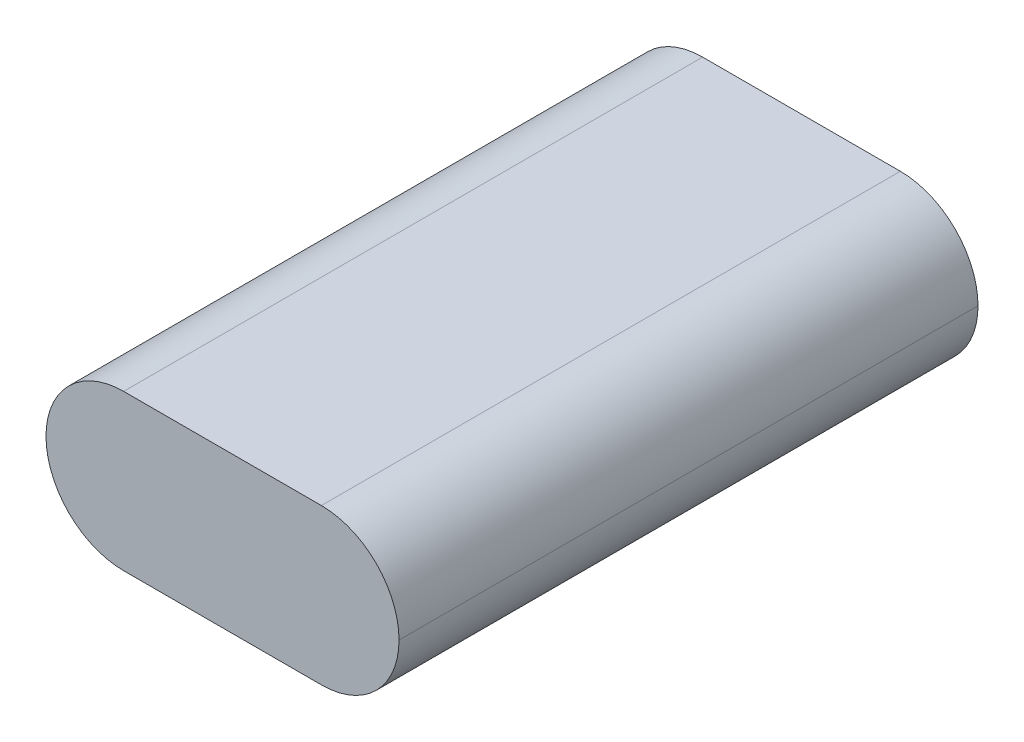
ISO-10303-21;
HEADER;
FILE_DESCRIPTION(('STEP AP214'),'2;1');
FILE_NAME('part.step','',(''),(''),'','','');
FILE_SCHEMA(('AUTOMOTIVE_DESIGN { 1 0 10303 214 1 1 1 1 }'));
ENDSEC;
DATA;
#1=APPLICATION_CONTEXT('core data for automotive mechanical design processes');
#2=APPLICATION_PROTOCOL_DEFINITION('international standard','automotive_design',2000,#1);
#3=PRODUCT_CONTEXT('',#1,'mechanical');
#4=PRODUCT('Part','Part','',(#3));
#5=PRODUCT_RELATED_PRODUCT_CATEGORY('part','',(#4));
#6=PRODUCT_DEFINITION_FORMATION('','',#4);
#7=PRODUCT_DEFINITION_CONTEXT('part definition',#1,'design');
#8=PRODUCT_DEFINITION('design','',#6,#7);
#9=PRODUCT_DEFINITION_SHAPE('','',#8);
#10=(LENGTH_UNIT() NAMED_UNIT(*) SI_UNIT(.MILLI.,.METRE.));
#11=(NAMED_UNIT(*) PLANE_ANGLE_UNIT() SI_UNIT($,.RADIAN.));
#12=(NAMED_UNIT(*) SI_UNIT($,.STERADIAN.) SOLID_ANGLE_UNIT());
#13=UNCERTAINTY_MEASURE_WITH_UNIT(LENGTH_MEASURE(1.E-05),#10,'distance_accuracy_value','');
#14=(GEOMETRIC_REPRESENTATION_CONTEXT(3) GLOBAL_UNCERTAINTY_ASSIGNED_CONTEXT((#13)) GLOBAL_UNIT_ASSIGNED_CONTEXT((#10,
#11,#12)) REPRESENTATION_CONTEXT('',''));
#15=CARTESIAN_POINT('',(0.,0.,0.));
#16=DIRECTION('',(0.,0.,1.));
#17=DIRECTION('',(1.,0.,0.));
#18=AXIS2_PLACEMENT_3D('',#15,#16,#17);
#19=CARTESIAN_POINT('',(0.,11.,-41.));
#20=DIRECTION('',(0.,0.,1.));
#21=DIRECTION('',(1.,0.,0.));
#22=AXIS2_PLACEMENT_3D('',#19,#20,#21);
#23=PLANE('',#22);
#24=CARTESIAN_POINT('',(-19.5,5.5,-41.));
#25=DIRECTION('',(0.,0.,1.));
#26=DIRECTION('',(1.,0.,0.));
#27=AXIS2_PLACEMENT_3D('',#24,#25,#26);
#28=CIRCLE('',#27,5.5);
#29=CARTESIAN_POINT('',(-19.5,0.,-41.));
#30=VERTEX_POINT('',#29);
#31=CARTESIAN_POINT('',(-25.,5.5,-41.));
#32=VERTEX_POINT('',#31);
#33=EDGE_CURVE('E61',#30,#32,#28,.F.);
#34=ORIENTED_EDGE('',*,*,#33,.T.);
#35=CARTESIAN_POINT('',(-19.5,5.5,-41.));
#36=DIRECTION('',(0.,0.,1.));
#37=DIRECTION('',(1.,0.,0.));
#38=AXIS2_PLACEMENT_3D('',#35,#36,#37);
#39=CIRCLE('',#38,5.5);
#40=CARTESIAN_POINT('',(-19.5,11.,-41.));
#41=VERTEX_POINT('',#40);
#42=EDGE_CURVE('E105',#32,#41,#39,.F.);
#43=ORIENTED_EDGE('',*,*,#42,.T.);
#44=DIRECTION('',(-1.,0.,0.));
#45=VECTOR('',#44,1.);
#46=CARTESIAN_POINT('',(0.,11.,-41.));
#47=LINE('',#46,#45);
#48=CARTESIAN_POINT('',(-5.5,11.,-41.));
#49=VERTEX_POINT('',#48);
#50=EDGE_CURVE('E96',#49,#41,#47,.T.);
#51=ORIENTED_EDGE('',*,*,#50,.F.);
#52=CARTESIAN_POINT('',(-5.5,5.5,-41.));
#53=DIRECTION('',(0.,0.,1.));
#54=DIRECTION('',(1.,0.,0.));
#55=AXIS2_PLACEMENT_3D('',#52,#53,#54);
#56=CIRCLE('',#55,5.5);
#57=CARTESIAN_POINT('',(0.,5.5,-41.));
#58=VERTEX_POINT('',#57);
#59=EDGE_CURVE('E54',#49,#58,#56,.F.);
#60=ORIENTED_EDGE('',*,*,#59,.T.);
#61=CARTESIAN_POINT('',(-5.5,5.5,-41.));
#62=DIRECTION('',(0.,0.,1.));
#63=DIRECTION('',(1.,0.,0.));
#64=AXIS2_PLACEMENT_3D('',#61,#62,#63);
#65=CIRCLE('',#64,5.5);
#66=CARTESIAN_POINT('',(-5.5,0.,-41.));
#67=VERTEX_POINT('',#66);
#68=EDGE_CURVE('E110',#58,#67,#65,.F.);
#69=ORIENTED_EDGE('',*,*,#68,.T.);
#70=DIRECTION('',(-1.,0.,0.));
#71=VECTOR('',#70,1.);
#72=CARTESIAN_POINT('',(0.,0.,-41.));
#73=LINE('',#72,#71);
#74=EDGE_CURVE('E123',#67,#30,#73,.T.);
#75=ORIENTED_EDGE('',*,*,#74,.T.);
#76=EDGE_LOOP('',(#34,#43,#51,#60,#69,#75));
#77=FACE_BOUND('',#76,.T.);
#78=ADVANCED_FACE('F37',(#77),#23,.F.);
#79=CARTESIAN_POINT('',(0.,11.,0.));
#80=DIRECTION('',(0.,0.,-1.));
#81=DIRECTION('',(-1.,0.,0.));
#82=AXIS2_PLACEMENT_3D('',#79,#80,#81);
#83=PLANE('',#82);
#84=DIRECTION('',(1.,0.,0.));
#85=VECTOR('',#84,1.);
#86=CARTESIAN_POINT('',(0.,11.,0.));
#87=LINE('',#86,#85);
#88=CARTESIAN_POINT('',(-19.5,11.,0.));
#89=VERTEX_POINT('',#88);
#90=CARTESIAN_POINT('',(-5.5,11.,0.));
#91=VERTEX_POINT('',#90);
#92=EDGE_CURVE('E99',#89,#91,#87,.T.);
#93=ORIENTED_EDGE('',*,*,#92,.F.);
#94=CARTESIAN_POINT('',(-19.5,5.5,0.));
#95=DIRECTION('',(0.,0.,-1.));
#96=DIRECTION('',(-1.,0.,0.));
#97=AXIS2_PLACEMENT_3D('',#94,#95,#96);
#98=CIRCLE('',#97,5.5);
#99=CARTESIAN_POINT('',(-25.,5.5,0.));
#100=VERTEX_POINT('',#99);
#101=EDGE_CURVE('E111',#89,#100,#98,.F.);
#102=ORIENTED_EDGE('',*,*,#101,.T.);
#103=CARTESIAN_POINT('',(-19.5,5.5,0.));
#104=DIRECTION('',(0.,0.,-1.));
#105=DIRECTION('',(-1.,0.,0.));
#106=AXIS2_PLACEMENT_3D('',#103,#104,#105);
#107=CIRCLE('',#106,5.5);
#108=CARTESIAN_POINT('',(-19.5,0.,0.));
#109=VERTEX_POINT('',#108);
#110=EDGE_CURVE('E114',#100,#109,#107,.F.);
#111=ORIENTED_EDGE('',*,*,#110,.T.);
#112=DIRECTION('',(1.,0.,0.));
#113=VECTOR('',#112,1.);
#114=CARTESIAN_POINT('',(0.,0.,0.));
#115=LINE('',#114,#113);
#116=CARTESIAN_POINT('',(-5.5,0.,0.));
#117=VERTEX_POINT('',#116);
#118=EDGE_CURVE('E106',#109,#117,#115,.T.);
#119=ORIENTED_EDGE('',*,*,#118,.T.);
#120=CARTESIAN_POINT('',(-5.5,5.5,0.));
#121=DIRECTION('',(0.,0.,-1.));
#122=DIRECTION('',(-1.,0.,0.));
#123=AXIS2_PLACEMENT_3D('',#120,#121,#122);
#124=CIRCLE('',#123,5.5);
#125=CARTESIAN_POINT('',(0.,5.5,0.));
#126=VERTEX_POINT('',#125);
#127=EDGE_CURVE('E129',#117,#126,#124,.F.);
#128=ORIENTED_EDGE('',*,*,#127,.T.);
#129=CARTESIAN_POINT('',(-5.5,5.5,0.));
#130=DIRECTION('',(0.,0.,-1.));
#131=DIRECTION('',(-1.,0.,0.));
#132=AXIS2_PLACEMENT_3D('',#129,#130,#131);
#133=CIRCLE('',#132,5.5);
#134=EDGE_CURVE('E140',#126,#91,#133,.F.);
#135=ORIENTED_EDGE('',*,*,#134,.T.);
#136=EDGE_LOOP('',(#93,#102,#111,#119,#128,#135));
#137=FACE_BOUND('',#136,.T.);
#138=ADVANCED_FACE('F146',(#137),#83,.F.);
#139=CARTESIAN_POINT('',(0.,11.,0.));
#140=DIRECTION('',(0.,1.,0.));
#141=DIRECTION('',(0.,0.,1.));
#142=AXIS2_PLACEMENT_3D('',#139,#140,#141);
#143=PLANE('',#142);
#144=ORIENTED_EDGE('',*,*,#50,.T.);
#145=DIRECTION('',(0.,0.,1.));
#146=VECTOR('',#145,1.);
#147=CARTESIAN_POINT('',(-19.5,11.,0.));
#148=LINE('',#147,#146);
#149=EDGE_CURVE('E102',#41,#89,#148,.T.);
#150=ORIENTED_EDGE('',*,*,#149,.T.);
#151=ORIENTED_EDGE('',*,*,#92,.T.);
#152=DIRECTION('',(0.,0.,-1.));
#153=VECTOR('',#152,1.);
#154=CARTESIAN_POINT('',(-5.5,11.,-41.));
#155=LINE('',#154,#153);
#156=EDGE_CURVE('E93',#91,#49,#155,.T.);
#157=ORIENTED_EDGE('',*,*,#156,.T.);
#158=EDGE_LOOP('',(#144,#150,#151,#157));
#159=FACE_BOUND('',#158,.T.);
#160=ADVANCED_FACE('F94',(#159),#143,.T.);
#161=CARTESIAN_POINT('',(0.,0.,0.));
#162=DIRECTION('',(0.,1.,0.));
#163=DIRECTION('',(0.,0.,1.));
#164=AXIS2_PLACEMENT_3D('',#161,#162,#163);
#165=PLANE('',#164);
#166=ORIENTED_EDGE('',*,*,#118,.F.);
#167=DIRECTION('',(0.,0.,1.));
#168=VECTOR('',#167,1.);
#169=CARTESIAN_POINT('',(-19.5,0.,0.));
#170=LINE('',#169,#168);
#171=EDGE_CURVE('E11',#109,#30,#170,.F.);
#172=ORIENTED_EDGE('',*,*,#171,.T.);
#173=ORIENTED_EDGE('',*,*,#74,.F.);
#174=DIRECTION('',(0.,0.,-1.));
#175=VECTOR('',#174,1.);
#176=CARTESIAN_POINT('',(-5.5,0.,0.));
#177=LINE('',#176,#175);
#178=EDGE_CURVE('E46',#67,#117,#177,.F.);
#179=ORIENTED_EDGE('',*,*,#178,.T.);
#180=EDGE_LOOP('',(#166,#172,#173,#179));
#181=FACE_BOUND('',#180,.T.);
#182=ADVANCED_FACE('F133',(#181),#165,.F.);
#183=CARTESIAN_POINT('',(-19.5,5.5,0.));
#184=DIRECTION('',(0.,0.,1.));
#185=DIRECTION('',(1.,0.,0.));
#186=AXIS2_PLACEMENT_3D('',#183,#184,#185);
#187=CYLINDRICAL_SURFACE('',#186,5.5);
#188=DIRECTION('',(0.,0.,1.));
#189=VECTOR('',#188,1.);
#190=CARTESIAN_POINT('',(-25.,5.5,0.));
#191=LINE('',#190,#189);
#192=EDGE_CURVE('E121',#32,#100,#191,.T.);
#193=ORIENTED_EDGE('',*,*,#192,.F.);
#194=ORIENTED_EDGE('',*,*,#33,.F.);
#195=ORIENTED_EDGE('',*,*,#171,.F.);
#196=ORIENTED_EDGE('',*,*,#110,.F.);
#197=EDGE_LOOP('',(#193,#194,#195,#196));
#198=FACE_BOUND('',#197,.T.);
#199=ADVANCED_FACE('F138',(#198),#187,.T.);
#200=CARTESIAN_POINT('',(-19.5,5.5,0.));
#201=DIRECTION('',(0.,0.,-1.));
#202=DIRECTION('',(-1.,0.,0.));
#203=AXIS2_PLACEMENT_3D('',#200,#201,#202);
#204=CYLINDRICAL_SURFACE('',#203,5.5);
#205=ORIENTED_EDGE('',*,*,#42,.F.);
#206=ORIENTED_EDGE('',*,*,#192,.T.);
#207=ORIENTED_EDGE('',*,*,#101,.F.);
#208=ORIENTED_EDGE('',*,*,#149,.F.);
#209=EDGE_LOOP('',(#205,#206,#207,#208));
#210=FACE_BOUND('',#209,.T.);
#211=ADVANCED_FACE('F139',(#210),#204,.T.);
#212=CARTESIAN_POINT('',(-5.5,5.5,0.));
#213=DIRECTION('',(0.,0.,1.));
#214=DIRECTION('',(1.,0.,0.));
#215=AXIS2_PLACEMENT_3D('',#212,#213,#214);
#216=CYLINDRICAL_SURFACE('',#215,5.5);
#217=ORIENTED_EDGE('',*,*,#156,.F.);
#218=ORIENTED_EDGE('',*,*,#134,.F.);
#219=DIRECTION('',(0.,0.,-1.));
#220=VECTOR('',#219,1.);
#221=CARTESIAN_POINT('',(0.,5.5,0.));
#222=LINE('',#221,#220);
#223=EDGE_CURVE('E41',#58,#126,#222,.F.);
#224=ORIENTED_EDGE('',*,*,#223,.F.);
#225=ORIENTED_EDGE('',*,*,#59,.F.);
#226=EDGE_LOOP('',(#217,#218,#224,#225));
#227=FACE_BOUND('',#226,.T.);
#228=ADVANCED_FACE('F39',(#227),#216,.T.);
#229=CARTESIAN_POINT('',(-5.5,5.5,0.));
#230=DIRECTION('',(0.,0.,-1.));
#231=DIRECTION('',(-1.,0.,0.));
#232=AXIS2_PLACEMENT_3D('',#229,#230,#231);
#233=CYLINDRICAL_SURFACE('',#232,5.5);
#234=ORIENTED_EDGE('',*,*,#127,.F.);
#235=ORIENTED_EDGE('',*,*,#178,.F.);
#236=ORIENTED_EDGE('',*,*,#68,.F.);
#237=ORIENTED_EDGE('',*,*,#223,.T.);
#238=EDGE_LOOP('',(#234,#235,#236,#237));
#239=FACE_BOUND('',#238,.T.);
#240=ADVANCED_FACE('F127',(#239),#233,.T.);
#241=CLOSED_SHELL('',(#78,#138,#160,#182,#199,#211,#228,#240));
#242=MANIFOLD_SOLID_BREP('B2',#241);
#243=ADVANCED_BREP_SHAPE_REPRESENTATION('',(#18,#242),#14);
#244=SHAPE_DEFINITION_REPRESENTATION(#9,#243);
ENDSEC;
END-ISO-10303-21;
